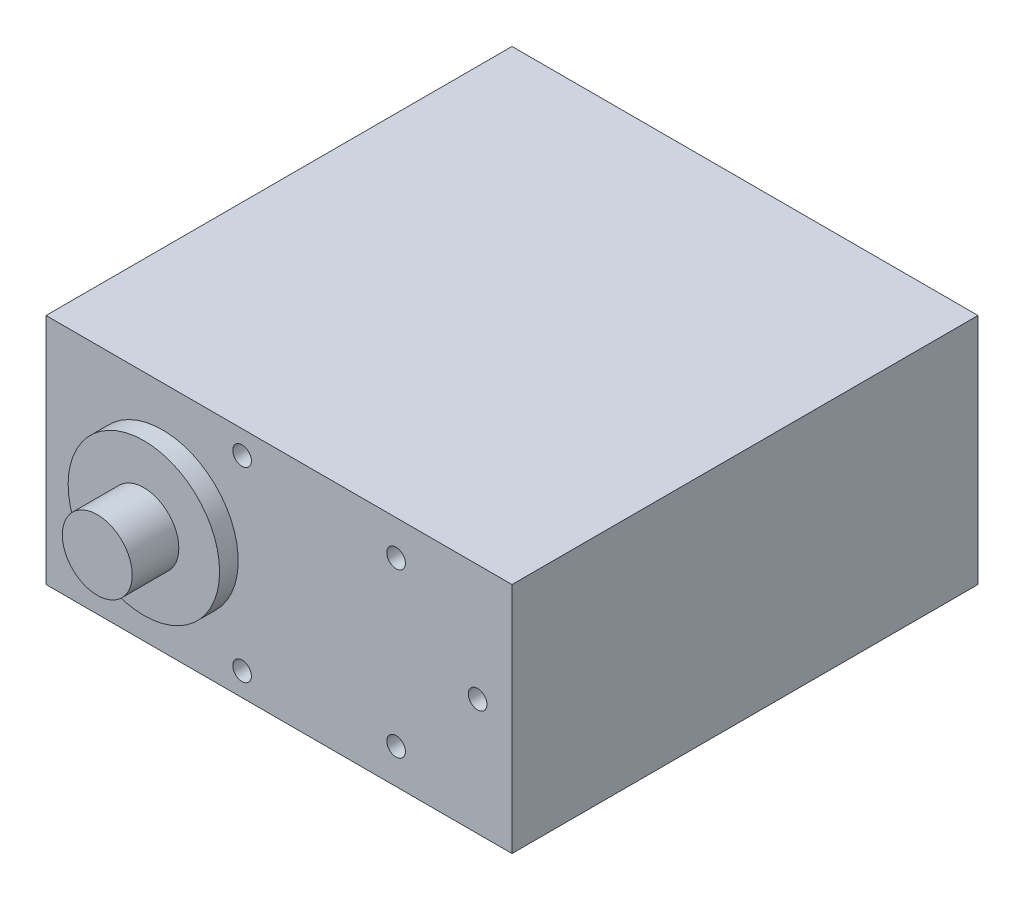
ISO-10303-21;
HEADER;
FILE_DESCRIPTION(('STEP AP214'),'2;1');
FILE_NAME('part.step','',(''),(''),'','','');
FILE_SCHEMA(('AUTOMOTIVE_DESIGN { 1 0 10303 214 1 1 1 1 }'));
ENDSEC;
DATA;
#1=APPLICATION_CONTEXT('core data for automotive mechanical design processes');
#2=APPLICATION_PROTOCOL_DEFINITION('international standard','automotive_design',2000,#1);
#3=PRODUCT_CONTEXT('',#1,'mechanical');
#4=PRODUCT('Part','Part','',(#3));
#5=PRODUCT_RELATED_PRODUCT_CATEGORY('part','',(#4));
#6=PRODUCT_DEFINITION_FORMATION('','',#4);
#7=PRODUCT_DEFINITION_CONTEXT('part definition',#1,'design');
#8=PRODUCT_DEFINITION('design','',#6,#7);
#9=PRODUCT_DEFINITION_SHAPE('','',#8);
#10=(LENGTH_UNIT() NAMED_UNIT(*) SI_UNIT(.MILLI.,.METRE.));
#11=(NAMED_UNIT(*) PLANE_ANGLE_UNIT() SI_UNIT($,.RADIAN.));
#12=(NAMED_UNIT(*) SI_UNIT($,.STERADIAN.) SOLID_ANGLE_UNIT());
#13=UNCERTAINTY_MEASURE_WITH_UNIT(LENGTH_MEASURE(1.E-05),#10,'distance_accuracy_value','');
#14=(GEOMETRIC_REPRESENTATION_CONTEXT(3) GLOBAL_UNCERTAINTY_ASSIGNED_CONTEXT((#13)) GLOBAL_UNIT_ASSIGNED_CONTEXT((#10,
#11,#12)) REPRESENTATION_CONTEXT('',''));
#15=CARTESIAN_POINT('',(0.,0.,0.));
#16=DIRECTION('',(0.,0.,1.));
#17=DIRECTION('',(1.,0.,0.));
#18=AXIS2_PLACEMENT_3D('',#15,#16,#17);
#19=CARTESIAN_POINT('',(0.,20.,0.));
#20=DIRECTION('',(1.,0.,0.));
#21=DIRECTION('',(0.,0.,-1.));
#22=AXIS2_PLACEMENT_3D('',#19,#20,#21);
#23=PLANE('',#22);
#24=DIRECTION('',(0.,0.,1.));
#25=VECTOR('',#24,1.);
#26=CARTESIAN_POINT('',(0.,0.,0.));
#27=LINE('',#26,#25);
#28=CARTESIAN_POINT('',(0.,0.,-40.));
#29=VERTEX_POINT('',#28);
#30=CARTESIAN_POINT('',(0.,0.,0.));
#31=VERTEX_POINT('',#30);
#32=EDGE_CURVE('E101',#29,#31,#27,.T.);
#33=ORIENTED_EDGE('',*,*,#32,.T.);
#34=DIRECTION('',(0.,-1.,0.));
#35=VECTOR('',#34,1.);
#36=CARTESIAN_POINT('',(0.,20.,0.));
#37=LINE('',#36,#35);
#38=CARTESIAN_POINT('',(0.,20.,0.));
#39=VERTEX_POINT('',#38);
#40=EDGE_CURVE('E92',#39,#31,#37,.T.);
#41=ORIENTED_EDGE('',*,*,#40,.F.);
#42=DIRECTION('',(0.,0.,1.));
#43=VECTOR('',#42,1.);
#44=CARTESIAN_POINT('',(0.,20.,0.));
#45=LINE('',#44,#43);
#46=CARTESIAN_POINT('',(0.,20.,-40.));
#47=VERTEX_POINT('',#46);
#48=EDGE_CURVE('E86',#47,#39,#45,.T.);
#49=ORIENTED_EDGE('',*,*,#48,.F.);
#50=DIRECTION('',(0.,-1.,0.));
#51=VECTOR('',#50,1.);
#52=CARTESIAN_POINT('',(0.,20.,-40.));
#53=LINE('',#52,#51);
#54=EDGE_CURVE('E97',#47,#29,#53,.T.);
#55=ORIENTED_EDGE('',*,*,#54,.T.);
#56=EDGE_LOOP('',(#33,#41,#49,#55));
#57=FACE_BOUND('',#56,.T.);
#58=ADVANCED_FACE('F33',(#57),#23,.F.);
#59=CARTESIAN_POINT('',(0.,20.,0.));
#60=DIRECTION('',(0.,0.,-1.));
#61=DIRECTION('',(-1.,0.,0.));
#62=AXIS2_PLACEMENT_3D('',#59,#60,#61);
#63=PLANE('',#62);
#64=CARTESIAN_POINT('',(10.,10.,0.));
#65=DIRECTION('',(0.,0.,-1.));
#66=DIRECTION('',(-1.,0.,0.));
#67=AXIS2_PLACEMENT_3D('',#64,#65,#66);
#68=CIRCLE('',#67,6.5);
#69=CARTESIAN_POINT('',(3.5,10.,0.));
#70=VERTEX_POINT('',#69);
#71=EDGE_CURVE('E110',#70,#70,#68,.F.);
#72=ORIENTED_EDGE('',*,*,#71,.F.);
#73=EDGE_LOOP('',(#72));
#74=FACE_BOUND('',#73,.T.);
#75=CARTESIAN_POINT('',(16.83,2.,0.));
#76=DIRECTION('',(0.,0.,-1.));
#77=DIRECTION('',(-1.,0.,0.));
#78=AXIS2_PLACEMENT_3D('',#75,#76,#77);
#79=CIRCLE('',#78,0.799999999999999);
#80=CARTESIAN_POINT('',(16.03,2.,0.));
#81=VERTEX_POINT('',#80);
#82=EDGE_CURVE('E161',#81,#81,#79,.T.);
#83=ORIENTED_EDGE('',*,*,#82,.T.);
#84=EDGE_LOOP('',(#83));
#85=FACE_BOUND('',#84,.T.);
#86=CARTESIAN_POINT('',(16.83,18.,0.));
#87=DIRECTION('',(0.,0.,-1.));
#88=DIRECTION('',(-1.,0.,0.));
#89=AXIS2_PLACEMENT_3D('',#86,#87,#88);
#90=CIRCLE('',#89,0.800000000000003);
#91=CARTESIAN_POINT('',(16.03,18.,0.));
#92=VERTEX_POINT('',#91);
#93=EDGE_CURVE('E180',#92,#92,#90,.T.);
#94=ORIENTED_EDGE('',*,*,#93,.T.);
#95=EDGE_LOOP('',(#94));
#96=FACE_BOUND('',#95,.T.);
#97=CARTESIAN_POINT('',(30.05,3.,0.));
#98=DIRECTION('',(0.,0.,-1.));
#99=DIRECTION('',(-1.,0.,0.));
#100=AXIS2_PLACEMENT_3D('',#97,#98,#99);
#101=CIRCLE('',#100,0.799999999999999);
#102=CARTESIAN_POINT('',(29.25,3.,0.));
#103=VERTEX_POINT('',#102);
#104=EDGE_CURVE('E174',#103,#103,#101,.T.);
#105=ORIENTED_EDGE('',*,*,#104,.T.);
#106=EDGE_LOOP('',(#105));
#107=FACE_BOUND('',#106,.T.);
#108=CARTESIAN_POINT('',(37.05,10.,0.));
#109=DIRECTION('',(0.,0.,-1.));
#110=DIRECTION('',(-1.,0.,0.));
#111=AXIS2_PLACEMENT_3D('',#108,#109,#110);
#112=CIRCLE('',#111,0.800000000000002);
#113=CARTESIAN_POINT('',(36.25,10.,0.));
#114=VERTEX_POINT('',#113);
#115=EDGE_CURVE('E168',#114,#114,#112,.T.);
#116=ORIENTED_EDGE('',*,*,#115,.T.);
#117=EDGE_LOOP('',(#116));
#118=FACE_BOUND('',#117,.T.);
#119=CARTESIAN_POINT('',(30.05,17.,0.));
#120=DIRECTION('',(0.,0.,-1.));
#121=DIRECTION('',(-1.,0.,0.));
#122=AXIS2_PLACEMENT_3D('',#119,#120,#121);
#123=CIRCLE('',#122,0.8);
#124=CARTESIAN_POINT('',(29.25,17.,0.));
#125=VERTEX_POINT('',#124);
#126=EDGE_CURVE('E167',#125,#125,#123,.T.);
#127=ORIENTED_EDGE('',*,*,#126,.T.);
#128=EDGE_LOOP('',(#127));
#129=FACE_BOUND('',#128,.T.);
#130=DIRECTION('',(1.,0.,0.));
#131=VECTOR('',#130,1.);
#132=CARTESIAN_POINT('',(0.,0.,0.));
#133=LINE('',#132,#131);
#134=CARTESIAN_POINT('',(40.,0.,0.));
#135=VERTEX_POINT('',#134);
#136=EDGE_CURVE('E91',#31,#135,#133,.T.);
#137=ORIENTED_EDGE('',*,*,#136,.T.);
#138=DIRECTION('',(0.,-1.,0.));
#139=VECTOR('',#138,1.);
#140=CARTESIAN_POINT('',(40.,20.,0.));
#141=LINE('',#140,#139);
#142=CARTESIAN_POINT('',(40.,20.,0.));
#143=VERTEX_POINT('',#142);
#144=EDGE_CURVE('E89',#143,#135,#141,.T.);
#145=ORIENTED_EDGE('',*,*,#144,.F.);
#146=DIRECTION('',(1.,0.,0.));
#147=VECTOR('',#146,1.);
#148=CARTESIAN_POINT('',(0.,20.,0.));
#149=LINE('',#148,#147);
#150=EDGE_CURVE('E81',#39,#143,#149,.T.);
#151=ORIENTED_EDGE('',*,*,#150,.F.);
#152=ORIENTED_EDGE('',*,*,#40,.T.);
#153=EDGE_LOOP('',(#137,#145,#151,#152));
#154=FACE_BOUND('',#153,.T.);
#155=ADVANCED_FACE('F90',(#74,#85,#96,#107,#118,#129,#154),#63,.F.);
#156=CARTESIAN_POINT('',(40.,20.,0.));
#157=DIRECTION('',(-1.,0.,0.));
#158=DIRECTION('',(0.,0.,1.));
#159=AXIS2_PLACEMENT_3D('',#156,#157,#158);
#160=PLANE('',#159);
#161=DIRECTION('',(0.,0.,-1.));
#162=VECTOR('',#161,1.);
#163=CARTESIAN_POINT('',(40.,0.,0.));
#164=LINE('',#163,#162);
#165=CARTESIAN_POINT('',(40.,0.,-40.));
#166=VERTEX_POINT('',#165);
#167=EDGE_CURVE('E67',#135,#166,#164,.T.);
#168=ORIENTED_EDGE('',*,*,#167,.T.);
#169=DIRECTION('',(0.,-1.,0.));
#170=VECTOR('',#169,1.);
#171=CARTESIAN_POINT('',(40.,20.,-40.));
#172=LINE('',#171,#170);
#173=CARTESIAN_POINT('',(40.,20.,-40.));
#174=VERTEX_POINT('',#173);
#175=EDGE_CURVE('E93',#174,#166,#172,.T.);
#176=ORIENTED_EDGE('',*,*,#175,.F.);
#177=DIRECTION('',(0.,0.,-1.));
#178=VECTOR('',#177,1.);
#179=CARTESIAN_POINT('',(40.,20.,0.));
#180=LINE('',#179,#178);
#181=EDGE_CURVE('E84',#143,#174,#180,.T.);
#182=ORIENTED_EDGE('',*,*,#181,.F.);
#183=ORIENTED_EDGE('',*,*,#144,.T.);
#184=EDGE_LOOP('',(#168,#176,#182,#183));
#185=FACE_BOUND('',#184,.T.);
#186=ADVANCED_FACE('F95',(#185),#160,.F.);
#187=CARTESIAN_POINT('',(0.,20.,-40.));
#188=DIRECTION('',(0.,0.,1.));
#189=DIRECTION('',(1.,0.,0.));
#190=AXIS2_PLACEMENT_3D('',#187,#188,#189);
#191=PLANE('',#190);
#192=CARTESIAN_POINT('',(10.,10.,-40.));
#193=DIRECTION('',(0.,0.,1.));
#194=DIRECTION('',(1.,0.,0.));
#195=AXIS2_PLACEMENT_3D('',#192,#193,#194);
#196=CIRCLE('',#195,6.5);
#197=CARTESIAN_POINT('',(16.5,10.,-40.));
#198=VERTEX_POINT('',#197);
#199=EDGE_CURVE('E36',#198,#198,#196,.F.);
#200=ORIENTED_EDGE('',*,*,#199,.F.);
#201=EDGE_LOOP('',(#200));
#202=FACE_BOUND('',#201,.T.);
#203=CARTESIAN_POINT('',(2.5,17.5,-40.));
#204=DIRECTION('',(0.,0.,-1.));
#205=DIRECTION('',(-1.,0.,0.));
#206=AXIS2_PLACEMENT_3D('',#203,#204,#205);
#207=CIRCLE('',#206,0.8);
#208=CARTESIAN_POINT('',(1.7,17.5,-40.));
#209=VERTEX_POINT('',#208);
#210=EDGE_CURVE('E131',#209,#209,#207,.T.);
#211=ORIENTED_EDGE('',*,*,#210,.F.);
#212=EDGE_LOOP('',(#211));
#213=FACE_BOUND('',#212,.T.);
#214=CARTESIAN_POINT('',(22.5,2.5,-40.));
#215=DIRECTION('',(0.,0.,-1.));
#216=DIRECTION('',(-1.,0.,0.));
#217=AXIS2_PLACEMENT_3D('',#214,#215,#216);
#218=CIRCLE('',#217,0.799999999999999);
#219=CARTESIAN_POINT('',(21.7,2.5,-40.));
#220=VERTEX_POINT('',#219);
#221=EDGE_CURVE('E138',#220,#220,#218,.T.);
#222=ORIENTED_EDGE('',*,*,#221,.F.);
#223=EDGE_LOOP('',(#222));
#224=FACE_BOUND('',#223,.T.);
#225=CARTESIAN_POINT('',(22.5,17.5,-40.));
#226=DIRECTION('',(0.,0.,-1.));
#227=DIRECTION('',(-1.,0.,0.));
#228=AXIS2_PLACEMENT_3D('',#225,#226,#227);
#229=CIRCLE('',#228,0.799999999999999);
#230=CARTESIAN_POINT('',(21.7,17.5,-40.));
#231=VERTEX_POINT('',#230);
#232=EDGE_CURVE('E137',#231,#231,#229,.T.);
#233=ORIENTED_EDGE('',*,*,#232,.F.);
#234=EDGE_LOOP('',(#233));
#235=FACE_BOUND('',#234,.T.);
#236=CARTESIAN_POINT('',(37.5,2.5,-40.));
#237=DIRECTION('',(0.,0.,-1.));
#238=DIRECTION('',(-1.,0.,0.));
#239=AXIS2_PLACEMENT_3D('',#236,#237,#238);
#240=CIRCLE('',#239,0.800000000000003);
#241=CARTESIAN_POINT('',(36.7,2.5,-40.));
#242=VERTEX_POINT('',#241);
#243=EDGE_CURVE('E150',#242,#242,#240,.T.);
#244=ORIENTED_EDGE('',*,*,#243,.F.);
#245=EDGE_LOOP('',(#244));
#246=FACE_BOUND('',#245,.T.);
#247=CARTESIAN_POINT('',(2.5,2.5,-40.));
#248=DIRECTION('',(0.,0.,-1.));
#249=DIRECTION('',(-1.,0.,0.));
#250=AXIS2_PLACEMENT_3D('',#247,#248,#249);
#251=CIRCLE('',#250,0.8);
#252=CARTESIAN_POINT('',(1.7,2.5,-40.));
#253=VERTEX_POINT('',#252);
#254=EDGE_CURVE('E127',#253,#253,#251,.T.);
#255=ORIENTED_EDGE('',*,*,#254,.F.);
#256=EDGE_LOOP('',(#255));
#257=FACE_BOUND('',#256,.T.);
#258=CARTESIAN_POINT('',(37.5,17.5,-40.));
#259=DIRECTION('',(0.,0.,-1.));
#260=DIRECTION('',(-1.,0.,0.));
#261=AXIS2_PLACEMENT_3D('',#258,#259,#260);
#262=CIRCLE('',#261,0.800000000000003);
#263=CARTESIAN_POINT('',(36.7,17.5,-40.));
#264=VERTEX_POINT('',#263);
#265=EDGE_CURVE('E149',#264,#264,#262,.T.);
#266=ORIENTED_EDGE('',*,*,#265,.F.);
#267=EDGE_LOOP('',(#266));
#268=FACE_BOUND('',#267,.T.);
#269=DIRECTION('',(-1.,0.,0.));
#270=VECTOR('',#269,1.);
#271=CARTESIAN_POINT('',(0.,0.,-40.));
#272=LINE('',#271,#270);
#273=EDGE_CURVE('E73',#166,#29,#272,.T.);
#274=ORIENTED_EDGE('',*,*,#273,.T.);
#275=ORIENTED_EDGE('',*,*,#54,.F.);
#276=DIRECTION('',(-1.,0.,0.));
#277=VECTOR('',#276,1.);
#278=CARTESIAN_POINT('',(0.,20.,-40.));
#279=LINE('',#278,#277);
#280=EDGE_CURVE('E50',#174,#47,#279,.T.);
#281=ORIENTED_EDGE('',*,*,#280,.F.);
#282=ORIENTED_EDGE('',*,*,#175,.T.);
#283=EDGE_LOOP('',(#274,#275,#281,#282));
#284=FACE_BOUND('',#283,.T.);
#285=ADVANCED_FACE('F217',(#202,#213,#224,#235,#246,#257,#268,#284),#191,.F.);
#286=CARTESIAN_POINT('',(0.,20.,0.));
#287=DIRECTION('',(0.,-1.,0.));
#288=DIRECTION('',(0.,0.,-1.));
#289=AXIS2_PLACEMENT_3D('',#286,#287,#288);
#290=PLANE('',#289);
#291=ORIENTED_EDGE('',*,*,#48,.T.);
#292=ORIENTED_EDGE('',*,*,#150,.T.);
#293=ORIENTED_EDGE('',*,*,#181,.T.);
#294=ORIENTED_EDGE('',*,*,#280,.T.);
#295=EDGE_LOOP('',(#291,#292,#293,#294));
#296=FACE_BOUND('',#295,.T.);
#297=ADVANCED_FACE('F82',(#296),#290,.F.);
#298=CARTESIAN_POINT('',(0.,0.,0.));
#299=DIRECTION('',(0.,-1.,0.));
#300=DIRECTION('',(0.,0.,-1.));
#301=AXIS2_PLACEMENT_3D('',#298,#299,#300);
#302=PLANE('',#301);
#303=ORIENTED_EDGE('',*,*,#32,.F.);
#304=ORIENTED_EDGE('',*,*,#273,.F.);
#305=ORIENTED_EDGE('',*,*,#167,.F.);
#306=ORIENTED_EDGE('',*,*,#136,.F.);
#307=EDGE_LOOP('',(#303,#304,#305,#306));
#308=FACE_BOUND('',#307,.T.);
#309=ADVANCED_FACE('F197',(#308),#302,.T.);
#310=CARTESIAN_POINT('',(30.05,17.,-10.));
#311=DIRECTION('',(0.,0.,1.));
#312=DIRECTION('',(1.,0.,0.));
#313=AXIS2_PLACEMENT_3D('',#310,#311,#312);
#314=CYLINDRICAL_SURFACE('',#313,0.8);
#315=CARTESIAN_POINT('',(30.05,17.,-10.));
#316=DIRECTION('',(0.,0.,-1.));
#317=DIRECTION('',(-1.,0.,0.));
#318=AXIS2_PLACEMENT_3D('',#315,#316,#317);
#319=CIRCLE('',#318,0.8);
#320=CARTESIAN_POINT('',(29.25,17.,-10.));
#321=VERTEX_POINT('',#320);
#322=EDGE_CURVE('E104',#321,#321,#319,.T.);
#323=ORIENTED_EDGE('',*,*,#322,.T.);
#324=EDGE_LOOP('',(#323));
#325=FACE_BOUND('',#324,.T.);
#326=ORIENTED_EDGE('',*,*,#126,.F.);
#327=EDGE_LOOP('',(#326));
#328=FACE_BOUND('',#327,.T.);
#329=ADVANCED_FACE('F194',(#325,#328),#314,.F.);
#330=CARTESIAN_POINT('',(30.05,17.,-10.));
#331=DIRECTION('',(0.,0.,-1.));
#332=DIRECTION('',(-1.,0.,0.));
#333=AXIS2_PLACEMENT_3D('',#330,#331,#332);
#334=PLANE('',#333);
#335=ORIENTED_EDGE('',*,*,#322,.F.);
#336=EDGE_LOOP('',(#335));
#337=FACE_BOUND('',#336,.T.);
#338=ADVANCED_FACE('F196',(#337),#334,.F.);
#339=CARTESIAN_POINT('',(37.05,10.,-10.));
#340=DIRECTION('',(0.,0.,1.));
#341=DIRECTION('',(1.,0.,0.));
#342=AXIS2_PLACEMENT_3D('',#339,#340,#341);
#343=CYLINDRICAL_SURFACE('',#342,0.800000000000002);
#344=CARTESIAN_POINT('',(37.05,10.,-10.));
#345=DIRECTION('',(0.,0.,-1.));
#346=DIRECTION('',(-1.,0.,0.));
#347=AXIS2_PLACEMENT_3D('',#344,#345,#346);
#348=CIRCLE('',#347,0.800000000000002);
#349=CARTESIAN_POINT('',(36.25,10.,-10.));
#350=VERTEX_POINT('',#349);
#351=EDGE_CURVE('E164',#350,#350,#348,.T.);
#352=ORIENTED_EDGE('',*,*,#351,.T.);
#353=EDGE_LOOP('',(#352));
#354=FACE_BOUND('',#353,.T.);
#355=ORIENTED_EDGE('',*,*,#115,.F.);
#356=EDGE_LOOP('',(#355));
#357=FACE_BOUND('',#356,.T.);
#358=ADVANCED_FACE('F204',(#354,#357),#343,.F.);
#359=CARTESIAN_POINT('',(37.05,10.,-10.));
#360=DIRECTION('',(0.,0.,-1.));
#361=DIRECTION('',(-1.,0.,0.));
#362=AXIS2_PLACEMENT_3D('',#359,#360,#361);
#363=PLANE('',#362);
#364=ORIENTED_EDGE('',*,*,#351,.F.);
#365=EDGE_LOOP('',(#364));
#366=FACE_BOUND('',#365,.T.);
#367=ADVANCED_FACE('F259',(#366),#363,.F.);
#368=CARTESIAN_POINT('',(30.05,3.,-10.));
#369=DIRECTION('',(0.,0.,1.));
#370=DIRECTION('',(1.,0.,0.));
#371=AXIS2_PLACEMENT_3D('',#368,#369,#370);
#372=CYLINDRICAL_SURFACE('',#371,0.799999999999999);
#373=CARTESIAN_POINT('',(30.05,3.,-10.));
#374=DIRECTION('',(0.,0.,-1.));
#375=DIRECTION('',(-1.,0.,0.));
#376=AXIS2_PLACEMENT_3D('',#373,#374,#375);
#377=CIRCLE('',#376,0.799999999999999);
#378=CARTESIAN_POINT('',(29.25,3.,-10.));
#379=VERTEX_POINT('',#378);
#380=EDGE_CURVE('E171',#379,#379,#377,.T.);
#381=ORIENTED_EDGE('',*,*,#380,.T.);
#382=EDGE_LOOP('',(#381));
#383=FACE_BOUND('',#382,.T.);
#384=ORIENTED_EDGE('',*,*,#104,.F.);
#385=EDGE_LOOP('',(#384));
#386=FACE_BOUND('',#385,.T.);
#387=ADVANCED_FACE('F262',(#383,#386),#372,.F.);
#388=CARTESIAN_POINT('',(30.05,3.,-10.));
#389=DIRECTION('',(0.,0.,-1.));
#390=DIRECTION('',(-1.,0.,0.));
#391=AXIS2_PLACEMENT_3D('',#388,#389,#390);
#392=PLANE('',#391);
#393=ORIENTED_EDGE('',*,*,#380,.F.);
#394=EDGE_LOOP('',(#393));
#395=FACE_BOUND('',#394,.T.);
#396=ADVANCED_FACE('F267',(#395),#392,.F.);
#397=CARTESIAN_POINT('',(16.83,18.,-10.));
#398=DIRECTION('',(0.,0.,1.));
#399=DIRECTION('',(1.,0.,0.));
#400=AXIS2_PLACEMENT_3D('',#397,#398,#399);
#401=CYLINDRICAL_SURFACE('',#400,0.800000000000003);
#402=CARTESIAN_POINT('',(16.83,18.,-10.));
#403=DIRECTION('',(0.,0.,-1.));
#404=DIRECTION('',(-1.,0.,0.));
#405=AXIS2_PLACEMENT_3D('',#402,#403,#404);
#406=CIRCLE('',#405,0.800000000000003);
#407=CARTESIAN_POINT('',(16.03,18.,-10.));
#408=VERTEX_POINT('',#407);
#409=EDGE_CURVE('E177',#408,#408,#406,.T.);
#410=ORIENTED_EDGE('',*,*,#409,.T.);
#411=EDGE_LOOP('',(#410));
#412=FACE_BOUND('',#411,.T.);
#413=ORIENTED_EDGE('',*,*,#93,.F.);
#414=EDGE_LOOP('',(#413));
#415=FACE_BOUND('',#414,.T.);
#416=ADVANCED_FACE('F270',(#412,#415),#401,.F.);
#417=CARTESIAN_POINT('',(16.83,18.,-10.));
#418=DIRECTION('',(0.,0.,-1.));
#419=DIRECTION('',(-1.,0.,0.));
#420=AXIS2_PLACEMENT_3D('',#417,#418,#419);
#421=PLANE('',#420);
#422=ORIENTED_EDGE('',*,*,#409,.F.);
#423=EDGE_LOOP('',(#422));
#424=FACE_BOUND('',#423,.T.);
#425=ADVANCED_FACE('F275',(#424),#421,.F.);
#426=CARTESIAN_POINT('',(16.83,2.,-10.));
#427=DIRECTION('',(0.,0.,1.));
#428=DIRECTION('',(1.,0.,0.));
#429=AXIS2_PLACEMENT_3D('',#426,#427,#428);
#430=CYLINDRICAL_SURFACE('',#429,0.799999999999999);
#431=CARTESIAN_POINT('',(16.83,2.,-10.));
#432=DIRECTION('',(0.,0.,-1.));
#433=DIRECTION('',(-1.,0.,0.));
#434=AXIS2_PLACEMENT_3D('',#431,#432,#433);
#435=CIRCLE('',#434,0.799999999999999);
#436=CARTESIAN_POINT('',(16.03,2.,-10.));
#437=VERTEX_POINT('',#436);
#438=EDGE_CURVE('E183',#437,#437,#435,.T.);
#439=ORIENTED_EDGE('',*,*,#438,.T.);
#440=EDGE_LOOP('',(#439));
#441=FACE_BOUND('',#440,.T.);
#442=ORIENTED_EDGE('',*,*,#82,.F.);
#443=EDGE_LOOP('',(#442));
#444=FACE_BOUND('',#443,.T.);
#445=ADVANCED_FACE('F253',(#441,#444),#430,.F.);
#446=CARTESIAN_POINT('',(16.83,2.,-10.));
#447=DIRECTION('',(0.,0.,-1.));
#448=DIRECTION('',(-1.,0.,0.));
#449=AXIS2_PLACEMENT_3D('',#446,#447,#448);
#450=PLANE('',#449);
#451=ORIENTED_EDGE('',*,*,#438,.F.);
#452=EDGE_LOOP('',(#451));
#453=FACE_BOUND('',#452,.T.);
#454=ADVANCED_FACE('F243',(#453),#450,.F.);
#455=CARTESIAN_POINT('',(37.5,17.5,-30.));
#456=DIRECTION('',(0.,0.,-1.));
#457=DIRECTION('',(-1.,0.,0.));
#458=AXIS2_PLACEMENT_3D('',#455,#456,#457);
#459=CYLINDRICAL_SURFACE('',#458,0.800000000000003);
#460=CARTESIAN_POINT('',(37.5,17.5,-30.));
#461=DIRECTION('',(0.,0.,-1.));
#462=DIRECTION('',(-1.,0.,0.));
#463=AXIS2_PLACEMENT_3D('',#460,#461,#462);
#464=CIRCLE('',#463,0.800000000000003);
#465=CARTESIAN_POINT('',(36.7,17.5,-30.));
#466=VERTEX_POINT('',#465);
#467=EDGE_CURVE('E158',#466,#466,#464,.T.);
#468=ORIENTED_EDGE('',*,*,#467,.F.);
#469=EDGE_LOOP('',(#468));
#470=FACE_BOUND('',#469,.T.);
#471=ORIENTED_EDGE('',*,*,#265,.T.);
#472=EDGE_LOOP('',(#471));
#473=FACE_BOUND('',#472,.T.);
#474=ADVANCED_FACE('F240',(#470,#473),#459,.F.);
#475=CARTESIAN_POINT('',(37.5,17.5,-30.));
#476=DIRECTION('',(0.,0.,-1.));
#477=DIRECTION('',(-1.,0.,0.));
#478=AXIS2_PLACEMENT_3D('',#475,#476,#477);
#479=PLANE('',#478);
#480=ORIENTED_EDGE('',*,*,#467,.T.);
#481=EDGE_LOOP('',(#480));
#482=FACE_BOUND('',#481,.T.);
#483=ADVANCED_FACE('F242',(#482),#479,.T.);
#484=CARTESIAN_POINT('',(2.5,2.5,-30.));
#485=DIRECTION('',(0.,0.,-1.));
#486=DIRECTION('',(-1.,0.,0.));
#487=AXIS2_PLACEMENT_3D('',#484,#485,#486);
#488=CYLINDRICAL_SURFACE('',#487,0.8);
#489=CARTESIAN_POINT('',(2.5,2.5,-30.));
#490=DIRECTION('',(0.,0.,-1.));
#491=DIRECTION('',(-1.,0.,0.));
#492=AXIS2_PLACEMENT_3D('',#489,#490,#491);
#493=CIRCLE('',#492,0.8);
#494=CARTESIAN_POINT('',(1.7,2.5,-30.));
#495=VERTEX_POINT('',#494);
#496=EDGE_CURVE('E128',#495,#495,#493,.T.);
#497=ORIENTED_EDGE('',*,*,#496,.F.);
#498=EDGE_LOOP('',(#497));
#499=FACE_BOUND('',#498,.T.);
#500=ORIENTED_EDGE('',*,*,#254,.T.);
#501=EDGE_LOOP('',(#500));
#502=FACE_BOUND('',#501,.T.);
#503=ADVANCED_FACE('F250',(#499,#502),#488,.F.);
#504=CARTESIAN_POINT('',(2.5,2.5,-30.));
#505=DIRECTION('',(0.,0.,-1.));
#506=DIRECTION('',(-1.,0.,0.));
#507=AXIS2_PLACEMENT_3D('',#504,#505,#506);
#508=PLANE('',#507);
#509=ORIENTED_EDGE('',*,*,#496,.T.);
#510=EDGE_LOOP('',(#509));
#511=FACE_BOUND('',#510,.T.);
#512=ADVANCED_FACE('F324',(#511),#508,.T.);
#513=CARTESIAN_POINT('',(37.5,2.5,-30.));
#514=DIRECTION('',(0.,0.,-1.));
#515=DIRECTION('',(-1.,0.,0.));
#516=AXIS2_PLACEMENT_3D('',#513,#514,#515);
#517=CYLINDRICAL_SURFACE('',#516,0.800000000000003);
#518=CARTESIAN_POINT('',(37.5,2.5,-30.));
#519=DIRECTION('',(0.,0.,-1.));
#520=DIRECTION('',(-1.,0.,0.));
#521=AXIS2_PLACEMENT_3D('',#518,#519,#520);
#522=CIRCLE('',#521,0.800000000000003);
#523=CARTESIAN_POINT('',(36.7,2.5,-30.));
#524=VERTEX_POINT('',#523);
#525=EDGE_CURVE('E146',#524,#524,#522,.T.);
#526=ORIENTED_EDGE('',*,*,#525,.F.);
#527=EDGE_LOOP('',(#526));
#528=FACE_BOUND('',#527,.T.);
#529=ORIENTED_EDGE('',*,*,#243,.T.);
#530=EDGE_LOOP('',(#529));
#531=FACE_BOUND('',#530,.T.);
#532=ADVANCED_FACE('F334',(#528,#531),#517,.F.);
#533=CARTESIAN_POINT('',(37.5,2.5,-30.));
#534=DIRECTION('',(0.,0.,-1.));
#535=DIRECTION('',(-1.,0.,0.));
#536=AXIS2_PLACEMENT_3D('',#533,#534,#535);
#537=PLANE('',#536);
#538=ORIENTED_EDGE('',*,*,#525,.T.);
#539=EDGE_LOOP('',(#538));
#540=FACE_BOUND('',#539,.T.);
#541=ADVANCED_FACE('F344',(#540),#537,.T.);
#542=CARTESIAN_POINT('',(22.5,17.5,-30.));
#543=DIRECTION('',(0.,0.,-1.));
#544=DIRECTION('',(-1.,0.,0.));
#545=AXIS2_PLACEMENT_3D('',#542,#543,#544);
#546=CYLINDRICAL_SURFACE('',#545,0.799999999999999);
#547=CARTESIAN_POINT('',(22.5,17.5,-30.));
#548=DIRECTION('',(0.,0.,-1.));
#549=DIRECTION('',(-1.,0.,0.));
#550=AXIS2_PLACEMENT_3D('',#547,#548,#549);
#551=CIRCLE('',#550,0.799999999999999);
#552=CARTESIAN_POINT('',(21.7,17.5,-30.));
#553=VERTEX_POINT('',#552);
#554=EDGE_CURVE('E153',#553,#553,#551,.T.);
#555=ORIENTED_EDGE('',*,*,#554,.F.);
#556=EDGE_LOOP('',(#555));
#557=FACE_BOUND('',#556,.T.);
#558=ORIENTED_EDGE('',*,*,#232,.T.);
#559=EDGE_LOOP('',(#558));
#560=FACE_BOUND('',#559,.T.);
#561=ADVANCED_FACE('F354',(#557,#560),#546,.F.);
#562=CARTESIAN_POINT('',(22.5,17.5,-30.));
#563=DIRECTION('',(0.,0.,-1.));
#564=DIRECTION('',(-1.,0.,0.));
#565=AXIS2_PLACEMENT_3D('',#562,#563,#564);
#566=PLANE('',#565);
#567=ORIENTED_EDGE('',*,*,#554,.T.);
#568=EDGE_LOOP('',(#567));
#569=FACE_BOUND('',#568,.T.);
#570=ADVANCED_FACE('F364',(#569),#566,.T.);
#571=CARTESIAN_POINT('',(22.5,2.5,-30.));
#572=DIRECTION('',(0.,0.,-1.));
#573=DIRECTION('',(-1.,0.,0.));
#574=AXIS2_PLACEMENT_3D('',#571,#572,#573);
#575=CYLINDRICAL_SURFACE('',#574,0.799999999999999);
#576=CARTESIAN_POINT('',(22.5,2.5,-30.));
#577=DIRECTION('',(0.,0.,-1.));
#578=DIRECTION('',(-1.,0.,0.));
#579=AXIS2_PLACEMENT_3D('',#576,#577,#578);
#580=CIRCLE('',#579,0.799999999999999);
#581=CARTESIAN_POINT('',(21.7,2.5,-30.));
#582=VERTEX_POINT('',#581);
#583=EDGE_CURVE('E134',#582,#582,#580,.T.);
#584=ORIENTED_EDGE('',*,*,#583,.F.);
#585=EDGE_LOOP('',(#584));
#586=FACE_BOUND('',#585,.T.);
#587=ORIENTED_EDGE('',*,*,#221,.T.);
#588=EDGE_LOOP('',(#587));
#589=FACE_BOUND('',#588,.T.);
#590=ADVANCED_FACE('F373',(#586,#589),#575,.F.);
#591=CARTESIAN_POINT('',(22.5,2.5,-30.));
#592=DIRECTION('',(0.,0.,-1.));
#593=DIRECTION('',(-1.,0.,0.));
#594=AXIS2_PLACEMENT_3D('',#591,#592,#593);
#595=PLANE('',#594);
#596=ORIENTED_EDGE('',*,*,#583,.T.);
#597=EDGE_LOOP('',(#596));
#598=FACE_BOUND('',#597,.T.);
#599=ADVANCED_FACE('F383',(#598),#595,.T.);
#600=CARTESIAN_POINT('',(2.5,17.5,-30.));
#601=DIRECTION('',(0.,0.,-1.));
#602=DIRECTION('',(-1.,0.,0.));
#603=AXIS2_PLACEMENT_3D('',#600,#601,#602);
#604=CYLINDRICAL_SURFACE('',#603,0.8);
#605=CARTESIAN_POINT('',(2.5,17.5,-30.));
#606=DIRECTION('',(0.,0.,-1.));
#607=DIRECTION('',(-1.,0.,0.));
#608=AXIS2_PLACEMENT_3D('',#605,#606,#607);
#609=CIRCLE('',#608,0.8);
#610=CARTESIAN_POINT('',(1.7,17.5,-30.));
#611=VERTEX_POINT('',#610);
#612=EDGE_CURVE('E141',#611,#611,#609,.T.);
#613=ORIENTED_EDGE('',*,*,#612,.F.);
#614=EDGE_LOOP('',(#613));
#615=FACE_BOUND('',#614,.T.);
#616=ORIENTED_EDGE('',*,*,#210,.T.);
#617=EDGE_LOOP('',(#616));
#618=FACE_BOUND('',#617,.T.);
#619=ADVANCED_FACE('F393',(#615,#618),#604,.F.);
#620=CARTESIAN_POINT('',(2.5,17.5,-30.));
#621=DIRECTION('',(0.,0.,-1.));
#622=DIRECTION('',(-1.,0.,0.));
#623=AXIS2_PLACEMENT_3D('',#620,#621,#622);
#624=PLANE('',#623);
#625=ORIENTED_EDGE('',*,*,#612,.T.);
#626=EDGE_LOOP('',(#625));
#627=FACE_BOUND('',#626,.T.);
#628=ADVANCED_FACE('F403',(#627),#624,.T.);
#629=CARTESIAN_POINT('',(10.,10.,1.6));
#630=DIRECTION('',(0.,0.,-1.));
#631=DIRECTION('',(-1.,0.,0.));
#632=AXIS2_PLACEMENT_3D('',#629,#630,#631);
#633=CYLINDRICAL_SURFACE('',#632,6.5);
#634=CARTESIAN_POINT('',(10.,10.,1.6));
#635=DIRECTION('',(0.,0.,1.));
#636=DIRECTION('',(1.,0.,0.));
#637=AXIS2_PLACEMENT_3D('',#634,#635,#636);
#638=CIRCLE('',#637,6.5);
#639=CARTESIAN_POINT('',(16.5,10.,1.6));
#640=VERTEX_POINT('',#639);
#641=EDGE_CURVE('E124',#640,#640,#638,.T.);
#642=ORIENTED_EDGE('',*,*,#641,.F.);
#643=EDGE_LOOP('',(#642));
#644=FACE_BOUND('',#643,.T.);
#645=ORIENTED_EDGE('',*,*,#71,.T.);
#646=EDGE_LOOP('',(#645));
#647=FACE_BOUND('',#646,.T.);
#648=ADVANCED_FACE('F413',(#644,#647),#633,.T.);
#649=CARTESIAN_POINT('',(10.,10.,1.6));
#650=DIRECTION('',(0.,0.,1.));
#651=DIRECTION('',(1.,0.,0.));
#652=AXIS2_PLACEMENT_3D('',#649,#650,#651);
#653=PLANE('',#652);
#654=CARTESIAN_POINT('',(10.,10.,1.6));
#655=DIRECTION('',(0.,0.,1.));
#656=DIRECTION('',(1.,0.,0.));
#657=AXIS2_PLACEMENT_3D('',#654,#655,#656);
#658=CIRCLE('',#657,3.);
#659=CARTESIAN_POINT('',(13.,10.,1.6));
#660=VERTEX_POINT('',#659);
#661=EDGE_CURVE('E112',#660,#660,#658,.T.);
#662=ORIENTED_EDGE('',*,*,#661,.F.);
#663=EDGE_LOOP('',(#662));
#664=FACE_BOUND('',#663,.T.);
#665=ORIENTED_EDGE('',*,*,#641,.T.);
#666=EDGE_LOOP('',(#665));
#667=FACE_BOUND('',#666,.T.);
#668=ADVANCED_FACE('F431',(#664,#667),#653,.T.);
#669=CARTESIAN_POINT('',(10.,10.,5.6));
#670=DIRECTION('',(0.,0.,-1.));
#671=DIRECTION('',(-1.,0.,0.));
#672=AXIS2_PLACEMENT_3D('',#669,#670,#671);
#673=CYLINDRICAL_SURFACE('',#672,3.);
#674=CARTESIAN_POINT('',(10.,10.,5.6));
#675=DIRECTION('',(0.,0.,1.));
#676=DIRECTION('',(1.,0.,0.));
#677=AXIS2_PLACEMENT_3D('',#674,#675,#676);
#678=CIRCLE('',#677,3.);
#679=CARTESIAN_POINT('',(13.,10.,5.6));
#680=VERTEX_POINT('',#679);
#681=EDGE_CURVE('E122',#680,#680,#678,.T.);
#682=ORIENTED_EDGE('',*,*,#681,.F.);
#683=EDGE_LOOP('',(#682));
#684=FACE_BOUND('',#683,.T.);
#685=ORIENTED_EDGE('',*,*,#661,.T.);
#686=EDGE_LOOP('',(#685));
#687=FACE_BOUND('',#686,.T.);
#688=ADVANCED_FACE('F441',(#684,#687),#673,.T.);
#689=CARTESIAN_POINT('',(10.,10.,5.6));
#690=DIRECTION('',(0.,0.,1.));
#691=DIRECTION('',(1.,0.,0.));
#692=AXIS2_PLACEMENT_3D('',#689,#690,#691);
#693=PLANE('',#692);
#694=ORIENTED_EDGE('',*,*,#681,.T.);
#695=EDGE_LOOP('',(#694));
#696=FACE_BOUND('',#695,.T.);
#697=ADVANCED_FACE('F451',(#696),#693,.T.);
#698=CARTESIAN_POINT('',(10.,10.,-41.6));
#699=DIRECTION('',(0.,0.,1.));
#700=DIRECTION('',(1.,0.,0.));
#701=AXIS2_PLACEMENT_3D('',#698,#699,#700);
#702=CYLINDRICAL_SURFACE('',#701,6.5);
#703=CARTESIAN_POINT('',(10.,10.,-41.6));
#704=DIRECTION('',(0.,0.,-1.));
#705=DIRECTION('',(-1.,0.,0.));
#706=AXIS2_PLACEMENT_3D('',#703,#704,#705);
#707=CIRCLE('',#706,6.5);
#708=CARTESIAN_POINT('',(3.5,10.,-41.6));
#709=VERTEX_POINT('',#708);
#710=EDGE_CURVE('E513',#709,#709,#707,.T.);
#711=ORIENTED_EDGE('',*,*,#710,.F.);
#712=EDGE_LOOP('',(#711));
#713=FACE_BOUND('',#712,.T.);
#714=ORIENTED_EDGE('',*,*,#199,.T.);
#715=EDGE_LOOP('',(#714));
#716=FACE_BOUND('',#715,.T.);
#717=ADVANCED_FACE('F460',(#713,#716),#702,.T.);
#718=CARTESIAN_POINT('',(10.,10.,-41.6));
#719=DIRECTION('',(0.,0.,-1.));
#720=DIRECTION('',(-1.,0.,0.));
#721=AXIS2_PLACEMENT_3D('',#718,#719,#720);
#722=PLANE('',#721);
#723=CARTESIAN_POINT('',(10.,10.,-41.6));
#724=DIRECTION('',(0.,0.,-1.));
#725=DIRECTION('',(-1.,0.,0.));
#726=AXIS2_PLACEMENT_3D('',#723,#724,#725);
#727=CIRCLE('',#726,3.);
#728=CARTESIAN_POINT('',(7.,10.,-41.6));
#729=VERTEX_POINT('',#728);
#730=EDGE_CURVE('E11',#729,#729,#727,.T.);
#731=ORIENTED_EDGE('',*,*,#730,.F.);
#732=EDGE_LOOP('',(#731));
#733=FACE_BOUND('',#732,.T.);
#734=ORIENTED_EDGE('',*,*,#710,.T.);
#735=EDGE_LOOP('',(#734));
#736=FACE_BOUND('',#735,.T.);
#737=ADVANCED_FACE('F476',(#733,#736),#722,.T.);
#738=CARTESIAN_POINT('',(10.,10.,-45.6));
#739=DIRECTION('',(0.,0.,1.));
#740=DIRECTION('',(1.,0.,0.));
#741=AXIS2_PLACEMENT_3D('',#738,#739,#740);
#742=CYLINDRICAL_SURFACE('',#741,3.);
#743=CARTESIAN_POINT('',(10.,10.,-45.6));
#744=DIRECTION('',(0.,0.,-1.));
#745=DIRECTION('',(-1.,0.,0.));
#746=AXIS2_PLACEMENT_3D('',#743,#744,#745);
#747=CIRCLE('',#746,3.);
#748=CARTESIAN_POINT('',(7.,10.,-45.6));
#749=VERTEX_POINT('',#748);
#750=EDGE_CURVE('E512',#749,#749,#747,.T.);
#751=ORIENTED_EDGE('',*,*,#750,.F.);
#752=EDGE_LOOP('',(#751));
#753=FACE_BOUND('',#752,.T.);
#754=ORIENTED_EDGE('',*,*,#730,.T.);
#755=EDGE_LOOP('',(#754));
#756=FACE_BOUND('',#755,.T.);
#757=ADVANCED_FACE('F486',(#753,#756),#742,.T.);
#758=CARTESIAN_POINT('',(10.,10.,-45.6));
#759=DIRECTION('',(0.,0.,-1.));
#760=DIRECTION('',(-1.,0.,0.));
#761=AXIS2_PLACEMENT_3D('',#758,#759,#760);
#762=PLANE('',#761);
#763=ORIENTED_EDGE('',*,*,#750,.T.);
#764=EDGE_LOOP('',(#763));
#765=FACE_BOUND('',#764,.T.);
#766=ADVANCED_FACE('F496',(#765),#762,.T.);
#767=CLOSED_SHELL('',(#58,#155,#186,#285,#297,#309,#329,#338,#358,#367,#387,#396,#416,#425,#445,
#454,#474,#483,#503,#512,#532,#541,#561,#570,#590,#599,#619,#628,#648,#668,#688,#697,#717,#737,
#757,#766));
#768=MANIFOLD_SOLID_BREP('B2',#767);
#769=ADVANCED_BREP_SHAPE_REPRESENTATION('',(#18,#768),#14);
#770=SHAPE_DEFINITION_REPRESENTATION(#9,#769);
ENDSEC;
END-ISO-10303-21;
